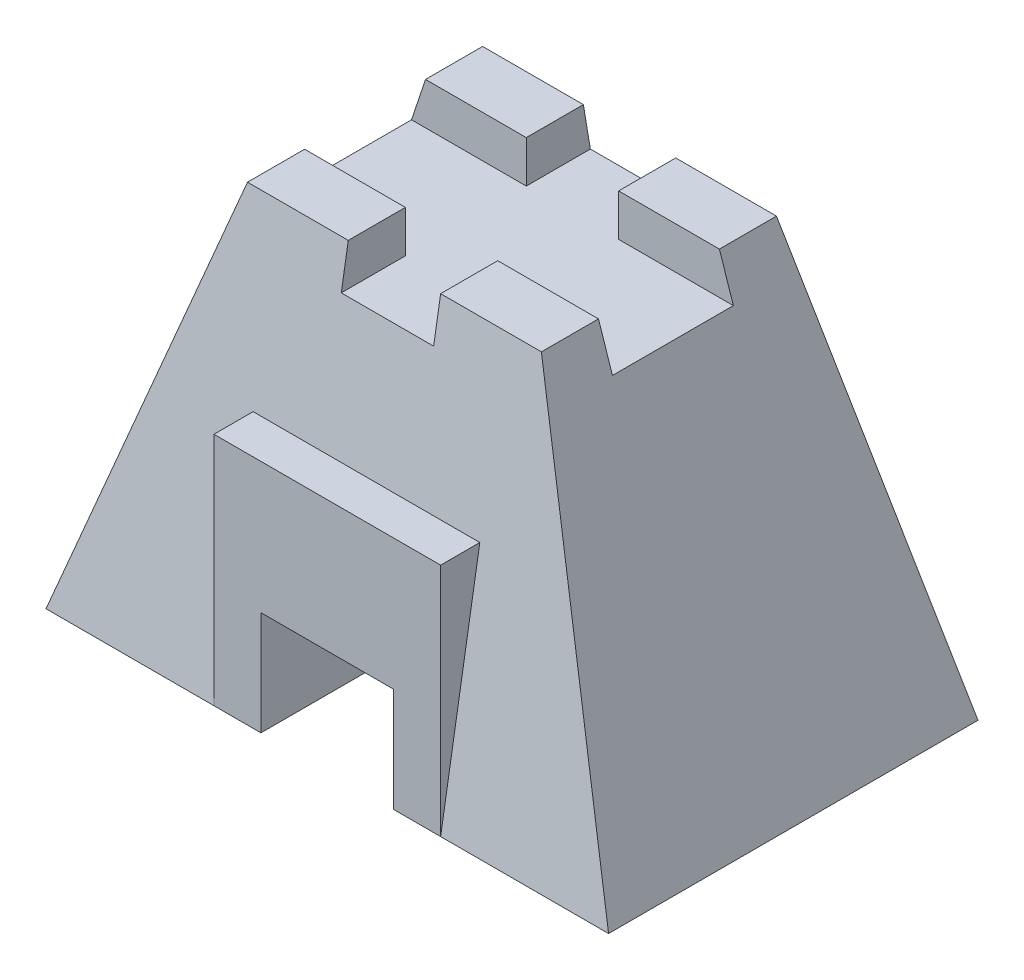
ISO-10303-21;
HEADER;
FILE_DESCRIPTION(('STEP AP214'),'2;1');
FILE_NAME('part.step','',(''),(''),'','','');
FILE_SCHEMA(('AUTOMOTIVE_DESIGN { 1 0 10303 214 1 1 1 1 }'));
ENDSEC;
DATA;
#1=APPLICATION_CONTEXT('core data for automotive mechanical design processes');
#2=APPLICATION_PROTOCOL_DEFINITION('international standard','automotive_design',2000,#1);
#3=PRODUCT_CONTEXT('',#1,'mechanical');
#4=PRODUCT('Part','Part','',(#3));
#5=PRODUCT_RELATED_PRODUCT_CATEGORY('part','',(#4));
#6=PRODUCT_DEFINITION_FORMATION('','',#4);
#7=PRODUCT_DEFINITION_CONTEXT('part definition',#1,'design');
#8=PRODUCT_DEFINITION('design','',#6,#7);
#9=PRODUCT_DEFINITION_SHAPE('','',#8);
#10=(LENGTH_UNIT() NAMED_UNIT(*) SI_UNIT(.MILLI.,.METRE.));
#11=(NAMED_UNIT(*) PLANE_ANGLE_UNIT() SI_UNIT($,.RADIAN.));
#12=(NAMED_UNIT(*) SI_UNIT($,.STERADIAN.) SOLID_ANGLE_UNIT());
#13=UNCERTAINTY_MEASURE_WITH_UNIT(LENGTH_MEASURE(1.E-05),#10,'distance_accuracy_value','');
#14=(GEOMETRIC_REPRESENTATION_CONTEXT(3) GLOBAL_UNCERTAINTY_ASSIGNED_CONTEXT((#13)) GLOBAL_UNIT_ASSIGNED_CONTEXT((#10,
#11,#12)) REPRESENTATION_CONTEXT('',''));
#15=CARTESIAN_POINT('',(0.,0.,0.));
#16=DIRECTION('',(0.,0.,1.));
#17=DIRECTION('',(1.,0.,0.));
#18=AXIS2_PLACEMENT_3D('',#15,#16,#17);
#19=CARTESIAN_POINT('',(0.,0.,0.));
#20=DIRECTION('',(0.,1.,0.));
#21=DIRECTION('',(0.,0.,1.));
#22=AXIS2_PLACEMENT_3D('',#19,#20,#21);
#23=PLANE('',#22);
#24=DIRECTION('',(-1.,0.,0.));
#25=VECTOR('',#24,1.);
#26=CARTESIAN_POINT('',(212.725,0.,-139.7));
#27=LINE('',#26,#25);
#28=CARTESIAN_POINT('',(-50.165,0.,-139.7));
#29=VERTEX_POINT('',#28);
#30=CARTESIAN_POINT('',(-212.725,0.,-139.7));
#31=VERTEX_POINT('',#30);
#32=EDGE_CURVE('E231',#29,#31,#27,.T.);
#33=ORIENTED_EDGE('',*,*,#32,.F.);
#34=DIRECTION('',(0.,0.,1.));
#35=VECTOR('',#34,1.);
#36=CARTESIAN_POINT('',(-50.165,0.,-261.556559371696));
#37=LINE('',#36,#35);
#38=CARTESIAN_POINT('',(-50.165,0.,139.7));
#39=VERTEX_POINT('',#38);
#40=EDGE_CURVE('E216',#29,#39,#37,.T.);
#41=ORIENTED_EDGE('',*,*,#40,.T.);
#42=DIRECTION('',(1.,0.,0.));
#43=VECTOR('',#42,1.);
#44=CARTESIAN_POINT('',(-85.725,0.,139.7));
#45=LINE('',#44,#43);
#46=CARTESIAN_POINT('',(-85.725,0.,139.7));
#47=VERTEX_POINT('',#46);
#48=EDGE_CURVE('E229',#47,#39,#45,.T.);
#49=ORIENTED_EDGE('',*,*,#48,.F.);
#50=DIRECTION('',(1.,0.,0.));
#51=VECTOR('',#50,1.);
#52=CARTESIAN_POINT('',(212.725,0.,139.7));
#53=LINE('',#52,#51);
#54=CARTESIAN_POINT('',(-212.725,0.,139.7));
#55=VERTEX_POINT('',#54);
#56=EDGE_CURVE('E253',#55,#47,#53,.T.);
#57=ORIENTED_EDGE('',*,*,#56,.F.);
#58=DIRECTION('',(0.,0.,1.));
#59=VECTOR('',#58,1.);
#60=CARTESIAN_POINT('',(-212.725,0.,139.7));
#61=LINE('',#60,#59);
#62=EDGE_CURVE('E594',#31,#55,#61,.T.);
#63=ORIENTED_EDGE('',*,*,#62,.F.);
#64=EDGE_LOOP('',(#33,#41,#49,#57,#63));
#65=FACE_BOUND('',#64,.T.);
#66=ADVANCED_FACE('F47',(#65),#23,.F.);
#67=CARTESIAN_POINT('',(0.,22.654054054054,135.924324324324));
#68=DIRECTION('',(0.,-0.164398987305357,-0.986393923832144));
#69=DIRECTION('',(0.,0.986393923832144,-0.164398987305357));
#70=AXIS2_PLACEMENT_3D('',#67,#68,#69);
#71=PLANE('',#70);
#72=DIRECTION('',(0.,-0.986393923832144,0.164398987305357));
#73=VECTOR('',#72,1.);
#74=CARTESIAN_POINT('',(-85.725,42.7326551276174,132.577890812064));
#75=LINE('',#74,#73);
#76=CARTESIAN_POINT('',(-85.725,177.8,110.066666666667));
#77=VERTEX_POINT('',#76);
#78=EDGE_CURVE('E74',#77,#47,#75,.T.);
#79=ORIENTED_EDGE('',*,*,#78,.F.);
#80=DIRECTION('',(-1.,0.,0.));
#81=VECTOR('',#80,1.);
#82=CARTESIAN_POINT('',(-85.725,177.8,110.066666666667));
#83=LINE('',#82,#81);
#84=CARTESIAN_POINT('',(85.725,177.8,110.066666666667));
#85=VERTEX_POINT('',#84);
#86=EDGE_CURVE('E632',#85,#77,#83,.T.);
#87=ORIENTED_EDGE('',*,*,#86,.F.);
#88=DIRECTION('',(0.,0.986393923832144,-0.164398987305357));
#89=VECTOR('',#88,1.);
#90=CARTESIAN_POINT('',(85.725,42.7326551276174,132.577890812064));
#91=LINE('',#90,#89);
#92=CARTESIAN_POINT('',(85.725,0.,139.7));
#93=VERTEX_POINT('',#92);
#94=EDGE_CURVE('E535',#93,#85,#91,.T.);
#95=ORIENTED_EDGE('',*,*,#94,.F.);
#96=CARTESIAN_POINT('',(212.725,0.,139.7));
#97=VERTEX_POINT('',#96);
#98=EDGE_CURVE('E258',#93,#97,#53,.T.);
#99=ORIENTED_EDGE('',*,*,#98,.T.);
#100=DIRECTION('',(-0.312347523777212,0.937042571331636,-0.156173761888606));
#101=VECTOR('',#100,1.);
#102=CARTESIAN_POINT('',(212.725,0.,139.7));
#103=LINE('',#102,#101);
#104=CARTESIAN_POINT('',(111.125,304.8,88.9));
#105=VERTEX_POINT('',#104);
#106=EDGE_CURVE('E676',#97,#105,#103,.T.);
#107=ORIENTED_EDGE('',*,*,#106,.T.);
#108=DIRECTION('',(1.,0.,0.));
#109=VECTOR('',#108,1.);
#110=CARTESIAN_POINT('',(111.125,304.8,88.9));
#111=LINE('',#110,#109);
#112=CARTESIAN_POINT('',(34.9249999999999,304.8,88.9));
#113=VERTEX_POINT('',#112);
#114=EDGE_CURVE('E458',#113,#105,#111,.T.);
#115=ORIENTED_EDGE('',*,*,#114,.F.);
#116=DIRECTION('',(0.,-0.986393923832144,0.164398987305357));
#117=VECTOR('',#116,1.);
#118=CARTESIAN_POINT('',(34.9249999999999,22.654054054054,135.924324324324));
#119=LINE('',#118,#117);
#120=CARTESIAN_POINT('',(34.9249999999999,273.05,94.1916666666667));
#121=VERTEX_POINT('',#120);
#122=EDGE_CURVE('E12',#113,#121,#119,.T.);
#123=ORIENTED_EDGE('',*,*,#122,.T.);
#124=DIRECTION('',(-1.,0.,0.));
#125=VECTOR('',#124,1.);
#126=CARTESIAN_POINT('',(0.,273.05,94.1916666666666));
#127=LINE('',#126,#125);
#128=CARTESIAN_POINT('',(-34.925,273.05,94.1916666666667));
#129=VERTEX_POINT('',#128);
#130=EDGE_CURVE('E586',#121,#129,#127,.T.);
#131=ORIENTED_EDGE('',*,*,#130,.T.);
#132=DIRECTION('',(0.,0.986393923832144,-0.164398987305357));
#133=VECTOR('',#132,1.);
#134=CARTESIAN_POINT('',(-34.925,22.654054054054,135.924324324324));
#135=LINE('',#134,#133);
#136=CARTESIAN_POINT('',(-34.925,304.8,88.9));
#137=VERTEX_POINT('',#136);
#138=EDGE_CURVE('E58',#129,#137,#135,.T.);
#139=ORIENTED_EDGE('',*,*,#138,.T.);
#140=CARTESIAN_POINT('',(-111.125,304.8,88.9));
#141=VERTEX_POINT('',#140);
#142=EDGE_CURVE('E315',#141,#137,#111,.T.);
#143=ORIENTED_EDGE('',*,*,#142,.F.);
#144=DIRECTION('',(0.312347523777212,0.937042571331636,-0.156173761888606));
#145=VECTOR('',#144,1.);
#146=CARTESIAN_POINT('',(-212.725,0.,139.7));
#147=LINE('',#146,#145);
#148=EDGE_CURVE('E513',#55,#141,#147,.T.);
#149=ORIENTED_EDGE('',*,*,#148,.F.);
#150=ORIENTED_EDGE('',*,*,#56,.T.);
#151=EDGE_LOOP('',(#79,#87,#95,#99,#107,#115,#123,#131,#139,#143,#149,#150));
#152=FACE_BOUND('',#151,.T.);
#153=ADVANCED_FACE('F491',(#152),#71,.F.);
#154=CARTESIAN_POINT('',(0.,304.8,0.));
#155=DIRECTION('',(0.,1.,0.));
#156=DIRECTION('',(0.,0.,1.));
#157=AXIS2_PLACEMENT_3D('',#154,#155,#156);
#158=PLANE('',#157);
#159=DIRECTION('',(-1.,0.,0.));
#160=VECTOR('',#159,1.);
#161=CARTESIAN_POINT('',(-34.925,304.8,-45.72));
#162=LINE('',#161,#160);
#163=CARTESIAN_POINT('',(-34.925,304.8,-45.72));
#164=VERTEX_POINT('',#163);
#165=CARTESIAN_POINT('',(-111.125,304.8,-45.72));
#166=VERTEX_POINT('',#165);
#167=EDGE_CURVE('E396',#164,#166,#162,.T.);
#168=ORIENTED_EDGE('',*,*,#167,.F.);
#169=DIRECTION('',(0.,0.,1.));
#170=VECTOR('',#169,1.);
#171=CARTESIAN_POINT('',(-34.925,304.8,-45.72));
#172=LINE('',#171,#170);
#173=CARTESIAN_POINT('',(-34.925,304.8,-88.9));
#174=VERTEX_POINT('',#173);
#175=EDGE_CURVE('E374',#174,#164,#172,.T.);
#176=ORIENTED_EDGE('',*,*,#175,.F.);
#177=DIRECTION('',(-1.,0.,0.));
#178=VECTOR('',#177,1.);
#179=CARTESIAN_POINT('',(111.125,304.8,-88.9));
#180=LINE('',#179,#178);
#181=CARTESIAN_POINT('',(-111.125,304.8,-88.9));
#182=VERTEX_POINT('',#181);
#183=EDGE_CURVE('E308',#174,#182,#180,.T.);
#184=ORIENTED_EDGE('',*,*,#183,.T.);
#185=DIRECTION('',(0.,0.,1.));
#186=VECTOR('',#185,1.);
#187=CARTESIAN_POINT('',(-111.125,304.8,88.9));
#188=LINE('',#187,#186);
#189=EDGE_CURVE('E705',#182,#166,#188,.T.);
#190=ORIENTED_EDGE('',*,*,#189,.T.);
#191=EDGE_LOOP('',(#168,#176,#184,#190));
#192=FACE_BOUND('',#191,.T.);
#193=ADVANCED_FACE('F500',(#192),#158,.T.);
#194=DIRECTION('',(0.,0.,-1.));
#195=VECTOR('',#194,1.);
#196=CARTESIAN_POINT('',(34.9249999999999,304.8,-45.72));
#197=LINE('',#196,#195);
#198=CARTESIAN_POINT('',(34.9249999999999,304.8,-45.72));
#199=VERTEX_POINT('',#198);
#200=CARTESIAN_POINT('',(34.9249999999999,304.8,-88.9));
#201=VERTEX_POINT('',#200);
#202=EDGE_CURVE('E419',#199,#201,#197,.T.);
#203=ORIENTED_EDGE('',*,*,#202,.F.);
#204=DIRECTION('',(-1.,0.,0.));
#205=VECTOR('',#204,1.);
#206=CARTESIAN_POINT('',(171.921254813928,304.8,-45.72));
#207=LINE('',#206,#205);
#208=CARTESIAN_POINT('',(111.125,304.8,-45.72));
#209=VERTEX_POINT('',#208);
#210=EDGE_CURVE('E417',#209,#199,#207,.T.);
#211=ORIENTED_EDGE('',*,*,#210,.F.);
#212=DIRECTION('',(0.,0.,-1.));
#213=VECTOR('',#212,1.);
#214=CARTESIAN_POINT('',(111.125,304.8,88.9));
#215=LINE('',#214,#213);
#216=CARTESIAN_POINT('',(111.125,304.8,-88.9));
#217=VERTEX_POINT('',#216);
#218=EDGE_CURVE('E331',#209,#217,#215,.T.);
#219=ORIENTED_EDGE('',*,*,#218,.T.);
#220=EDGE_CURVE('E352',#217,#201,#180,.T.);
#221=ORIENTED_EDGE('',*,*,#220,.T.);
#222=EDGE_LOOP('',(#203,#211,#219,#221));
#223=FACE_BOUND('',#222,.T.);
#224=ADVANCED_FACE('F730',(#223),#158,.T.);
#225=DIRECTION('',(1.,0.,0.));
#226=VECTOR('',#225,1.);
#227=CARTESIAN_POINT('',(171.921254813928,304.8,45.72));
#228=LINE('',#227,#226);
#229=CARTESIAN_POINT('',(34.9249999999999,304.8,45.72));
#230=VERTEX_POINT('',#229);
#231=CARTESIAN_POINT('',(111.125,304.8,45.72));
#232=VERTEX_POINT('',#231);
#233=EDGE_CURVE('E415',#230,#232,#228,.T.);
#234=ORIENTED_EDGE('',*,*,#233,.F.);
#235=DIRECTION('',(0.,0.,-1.));
#236=VECTOR('',#235,1.);
#237=CARTESIAN_POINT('',(34.9249999999999,304.8,107.229562048896));
#238=LINE('',#237,#236);
#239=EDGE_CURVE('E405',#113,#230,#238,.T.);
#240=ORIENTED_EDGE('',*,*,#239,.F.);
#241=ORIENTED_EDGE('',*,*,#114,.T.);
#242=EDGE_CURVE('E692',#105,#232,#215,.T.);
#243=ORIENTED_EDGE('',*,*,#242,.T.);
#244=EDGE_LOOP('',(#234,#240,#241,#243));
#245=FACE_BOUND('',#244,.T.);
#246=ADVANCED_FACE('F726',(#245),#158,.T.);
#247=DIRECTION('',(0.,0.,1.));
#248=VECTOR('',#247,1.);
#249=CARTESIAN_POINT('',(-34.925,304.8,107.229562048896));
#250=LINE('',#249,#248);
#251=CARTESIAN_POINT('',(-34.925,304.8,45.72));
#252=VERTEX_POINT('',#251);
#253=EDGE_CURVE('E403',#252,#137,#250,.T.);
#254=ORIENTED_EDGE('',*,*,#253,.F.);
#255=DIRECTION('',(1.,0.,0.));
#256=VECTOR('',#255,1.);
#257=CARTESIAN_POINT('',(-34.925,304.8,45.72));
#258=LINE('',#257,#256);
#259=CARTESIAN_POINT('',(-111.125,304.8,45.72));
#260=VERTEX_POINT('',#259);
#261=EDGE_CURVE('E399',#260,#252,#258,.T.);
#262=ORIENTED_EDGE('',*,*,#261,.F.);
#263=EDGE_CURVE('E453',#260,#141,#188,.T.);
#264=ORIENTED_EDGE('',*,*,#263,.T.);
#265=ORIENTED_EDGE('',*,*,#142,.T.);
#266=EDGE_LOOP('',(#254,#262,#264,#265));
#267=FACE_BOUND('',#266,.T.);
#268=ADVANCED_FACE('F49',(#267),#158,.T.);
#269=CARTESIAN_POINT('',(50.165,0.,139.7));
#270=VERTEX_POINT('',#269);
#271=EDGE_CURVE('E241',#270,#93,#45,.T.);
#272=ORIENTED_EDGE('',*,*,#271,.F.);
#273=DIRECTION('',(0.,0.,1.));
#274=VECTOR('',#273,1.);
#275=CARTESIAN_POINT('',(50.165,0.,-261.556559371696));
#276=LINE('',#275,#274);
#277=CARTESIAN_POINT('',(50.165,0.,-139.7));
#278=VERTEX_POINT('',#277);
#279=EDGE_CURVE('E66',#278,#270,#276,.T.);
#280=ORIENTED_EDGE('',*,*,#279,.F.);
#281=CARTESIAN_POINT('',(212.725,0.,-139.7));
#282=VERTEX_POINT('',#281);
#283=EDGE_CURVE('E52',#282,#278,#27,.T.);
#284=ORIENTED_EDGE('',*,*,#283,.F.);
#285=DIRECTION('',(0.,0.,-1.));
#286=VECTOR('',#285,1.);
#287=CARTESIAN_POINT('',(212.725,0.,139.7));
#288=LINE('',#287,#286);
#289=EDGE_CURVE('E550',#97,#282,#288,.T.);
#290=ORIENTED_EDGE('',*,*,#289,.F.);
#291=ORIENTED_EDGE('',*,*,#98,.F.);
#292=EDGE_LOOP('',(#272,#280,#284,#290,#291));
#293=FACE_BOUND('',#292,.T.);
#294=ADVANCED_FACE('F501',(#293),#23,.F.);
#295=CARTESIAN_POINT('',(-191.4525,63.8175,0.));
#296=DIRECTION('',(0.948683298050514,-0.316227766016838,0.));
#297=DIRECTION('',(0.316227766016838,0.948683298050514,0.));
#298=AXIS2_PLACEMENT_3D('',#295,#296,#297);
#299=PLANE('',#298);
#300=DIRECTION('',(0.312347523777212,0.937042571331636,0.156173761888606));
#301=VECTOR('',#300,1.);
#302=CARTESIAN_POINT('',(-212.725,0.,-139.7));
#303=LINE('',#302,#301);
#304=EDGE_CURVE('E271',#31,#182,#303,.T.);
#305=ORIENTED_EDGE('',*,*,#304,.F.);
#306=DIRECTION('',(0.233256168386668,0.699768505160003,0.675215224277196));
#307=VECTOR('',#306,1.);
#308=CARTESIAN_POINT('',(-193.827623416379,56.6921297508638,-84.9970677842542));
#309=LINE('',#308,#307);
#310=CARTESIAN_POINT('',(-164.465,144.78,0.));
#311=VERTEX_POINT('',#310);
#312=EDGE_CURVE('E361',#31,#311,#309,.T.);
#313=ORIENTED_EDGE('',*,*,#312,.T.);
#314=DIRECTION('',(-0.233256168386668,-0.699768505160003,0.675215224277196));
#315=VECTOR('',#314,1.);
#316=CARTESIAN_POINT('',(-148.193374735143,193.594875794571,-47.1020731351128));
#317=LINE('',#316,#315);
#318=EDGE_CURVE('E356',#311,#55,#317,.T.);
#319=ORIENTED_EDGE('',*,*,#318,.T.);
#320=ORIENTED_EDGE('',*,*,#148,.T.);
#321=ORIENTED_EDGE('',*,*,#263,.F.);
#322=DIRECTION('',(-0.316227766016838,-0.948683298050514,0.));
#323=VECTOR('',#322,1.);
#324=CARTESIAN_POINT('',(-191.4525,63.8175,45.72));
#325=LINE('',#324,#323);
#326=CARTESIAN_POINT('',(-121.708333333333,273.05,45.72));
#327=VERTEX_POINT('',#326);
#328=EDGE_CURVE('E577',#260,#327,#325,.T.);
#329=ORIENTED_EDGE('',*,*,#328,.T.);
#330=DIRECTION('',(0.,0.,-1.));
#331=VECTOR('',#330,1.);
#332=CARTESIAN_POINT('',(-121.708333333333,273.05,0.));
#333=LINE('',#332,#331);
#334=CARTESIAN_POINT('',(-121.708333333333,273.05,-45.72));
#335=VERTEX_POINT('',#334);
#336=EDGE_CURVE('E590',#327,#335,#333,.T.);
#337=ORIENTED_EDGE('',*,*,#336,.T.);
#338=DIRECTION('',(0.316227766016838,0.948683298050514,0.));
#339=VECTOR('',#338,1.);
#340=CARTESIAN_POINT('',(-191.4525,63.8175,-45.72));
#341=LINE('',#340,#339);
#342=EDGE_CURVE('E579',#335,#166,#341,.T.);
#343=ORIENTED_EDGE('',*,*,#342,.T.);
#344=ORIENTED_EDGE('',*,*,#189,.F.);
#345=EDGE_LOOP('',(#305,#313,#319,#320,#321,#329,#337,#343,#344));
#346=FACE_BOUND('',#345,.T.);
#347=ADVANCED_FACE('F504',(#346),#299,.F.);
#348=CARTESIAN_POINT('',(191.4525,63.8175,0.));
#349=DIRECTION('',(-0.948683298050514,-0.316227766016838,0.));
#350=DIRECTION('',(0.316227766016838,-0.948683298050514,0.));
#351=AXIS2_PLACEMENT_3D('',#348,#349,#350);
#352=PLANE('',#351);
#353=ORIENTED_EDGE('',*,*,#218,.F.);
#354=DIRECTION('',(0.316227766016838,-0.948683298050514,0.));
#355=VECTOR('',#354,1.);
#356=CARTESIAN_POINT('',(191.4525,63.8175,-45.72));
#357=LINE('',#356,#355);
#358=CARTESIAN_POINT('',(121.708333333333,273.05,-45.72));
#359=VERTEX_POINT('',#358);
#360=EDGE_CURVE('E580',#209,#359,#357,.T.);
#361=ORIENTED_EDGE('',*,*,#360,.T.);
#362=DIRECTION('',(0.,0.,1.));
#363=VECTOR('',#362,1.);
#364=CARTESIAN_POINT('',(121.708333333333,273.05,0.));
#365=LINE('',#364,#363);
#366=CARTESIAN_POINT('',(121.708333333333,273.05,45.72));
#367=VERTEX_POINT('',#366);
#368=EDGE_CURVE('E429',#359,#367,#365,.T.);
#369=ORIENTED_EDGE('',*,*,#368,.T.);
#370=DIRECTION('',(-0.316227766016838,0.948683298050514,0.));
#371=VECTOR('',#370,1.);
#372=CARTESIAN_POINT('',(191.4525,63.8175,45.72));
#373=LINE('',#372,#371);
#374=EDGE_CURVE('E322',#367,#232,#373,.T.);
#375=ORIENTED_EDGE('',*,*,#374,.T.);
#376=ORIENTED_EDGE('',*,*,#242,.F.);
#377=ORIENTED_EDGE('',*,*,#106,.F.);
#378=ORIENTED_EDGE('',*,*,#289,.T.);
#379=DIRECTION('',(-0.312347523777212,0.937042571331636,0.156173761888606));
#380=VECTOR('',#379,1.);
#381=CARTESIAN_POINT('',(212.725,0.,-139.7));
#382=LINE('',#381,#380);
#383=EDGE_CURVE('E652',#282,#217,#382,.T.);
#384=ORIENTED_EDGE('',*,*,#383,.T.);
#385=EDGE_LOOP('',(#353,#361,#369,#375,#376,#377,#378,#384));
#386=FACE_BOUND('',#385,.T.);
#387=ADVANCED_FACE('F284',(#386),#352,.F.);
#388=CARTESIAN_POINT('',(0.,22.6540540540541,-135.924324324324));
#389=DIRECTION('',(0.,-0.164398987305357,0.986393923832144));
#390=DIRECTION('',(0.,-0.986393923832144,-0.164398987305357));
#391=AXIS2_PLACEMENT_3D('',#388,#389,#390);
#392=PLANE('',#391);
#393=DIRECTION('',(1.,0.,0.));
#394=VECTOR('',#393,1.);
#395=CARTESIAN_POINT('',(-50.165,78.74,-126.576666666667));
#396=LINE('',#395,#394);
#397=CARTESIAN_POINT('',(-50.165,78.74,-126.576666666667));
#398=VERTEX_POINT('',#397);
#399=CARTESIAN_POINT('',(50.165,78.74,-126.576666666667));
#400=VERTEX_POINT('',#399);
#401=EDGE_CURVE('E616',#398,#400,#396,.T.);
#402=ORIENTED_EDGE('',*,*,#401,.F.);
#403=DIRECTION('',(0.,0.986393923832144,0.164398987305357));
#404=VECTOR('',#403,1.);
#405=CARTESIAN_POINT('',(-50.165,-19.7605231413562,-142.993420523559));
#406=LINE('',#405,#404);
#407=EDGE_CURVE('E617',#29,#398,#406,.T.);
#408=ORIENTED_EDGE('',*,*,#407,.F.);
#409=ORIENTED_EDGE('',*,*,#32,.T.);
#410=ORIENTED_EDGE('',*,*,#304,.T.);
#411=ORIENTED_EDGE('',*,*,#183,.F.);
#412=DIRECTION('',(0.,-0.986393923832144,-0.164398987305357));
#413=VECTOR('',#412,1.);
#414=CARTESIAN_POINT('',(-34.9249999999999,22.6540540540541,-135.924324324324));
#415=LINE('',#414,#413);
#416=CARTESIAN_POINT('',(-34.925,273.05,-94.1916666666667));
#417=VERTEX_POINT('',#416);
#418=EDGE_CURVE('E318',#174,#417,#415,.T.);
#419=ORIENTED_EDGE('',*,*,#418,.T.);
#420=DIRECTION('',(1.,0.,0.));
#421=VECTOR('',#420,1.);
#422=CARTESIAN_POINT('',(0.,273.05,-94.1916666666667));
#423=LINE('',#422,#421);
#424=CARTESIAN_POINT('',(34.9249999999999,273.05,-94.1916666666667));
#425=VERTEX_POINT('',#424);
#426=EDGE_CURVE('E311',#417,#425,#423,.T.);
#427=ORIENTED_EDGE('',*,*,#426,.T.);
#428=DIRECTION('',(0.,0.986393923832144,0.164398987305357));
#429=VECTOR('',#428,1.);
#430=CARTESIAN_POINT('',(34.9249999999999,22.6540540540541,-135.924324324324));
#431=LINE('',#430,#429);
#432=EDGE_CURVE('E314',#425,#201,#431,.T.);
#433=ORIENTED_EDGE('',*,*,#432,.T.);
#434=ORIENTED_EDGE('',*,*,#220,.F.);
#435=ORIENTED_EDGE('',*,*,#383,.F.);
#436=ORIENTED_EDGE('',*,*,#283,.T.);
#437=DIRECTION('',(0.,-0.986393923832144,-0.164398987305357));
#438=VECTOR('',#437,1.);
#439=CARTESIAN_POINT('',(50.165,-19.7605231413562,-142.993420523559));
#440=LINE('',#439,#438);
#441=EDGE_CURVE('E618',#400,#278,#440,.T.);
#442=ORIENTED_EDGE('',*,*,#441,.F.);
#443=EDGE_LOOP('',(#402,#408,#409,#410,#411,#419,#427,#433,#434,#435,#436,#442));
#444=FACE_BOUND('',#443,.T.);
#445=ADVANCED_FACE('F274',(#444),#392,.F.);
#446=CARTESIAN_POINT('',(34.9249999999999,273.05,107.229562048896));
#447=DIRECTION('',(1.,0.,0.));
#448=DIRECTION('',(0.,0.,-1.));
#449=AXIS2_PLACEMENT_3D('',#446,#447,#448);
#450=PLANE('',#449);
#451=ORIENTED_EDGE('',*,*,#239,.T.);
#452=DIRECTION('',(0.,1.,0.));
#453=VECTOR('',#452,1.);
#454=CARTESIAN_POINT('',(34.9249999999999,273.05,45.72));
#455=LINE('',#454,#453);
#456=CARTESIAN_POINT('',(34.9249999999999,273.05,45.72));
#457=VERTEX_POINT('',#456);
#458=EDGE_CURVE('E432',#457,#230,#455,.T.);
#459=ORIENTED_EDGE('',*,*,#458,.F.);
#460=DIRECTION('',(0.,0.,-1.));
#461=VECTOR('',#460,1.);
#462=CARTESIAN_POINT('',(34.9249999999999,273.05,107.229562048896));
#463=LINE('',#462,#461);
#464=EDGE_CURVE('E379',#121,#457,#463,.T.);
#465=ORIENTED_EDGE('',*,*,#464,.F.);
#466=ORIENTED_EDGE('',*,*,#122,.F.);
#467=EDGE_LOOP('',(#451,#459,#465,#466));
#468=FACE_BOUND('',#467,.T.);
#469=ADVANCED_FACE('F283',(#468),#450,.F.);
#470=CARTESIAN_POINT('',(-34.925,273.05,107.229562048896));
#471=DIRECTION('',(-1.,0.,0.));
#472=DIRECTION('',(0.,0.,1.));
#473=AXIS2_PLACEMENT_3D('',#470,#471,#472);
#474=PLANE('',#473);
#475=DIRECTION('',(0.,0.,1.));
#476=VECTOR('',#475,1.);
#477=CARTESIAN_POINT('',(-34.925,273.05,107.229562048896));
#478=LINE('',#477,#476);
#479=CARTESIAN_POINT('',(-34.925,273.05,45.72));
#480=VERTEX_POINT('',#479);
#481=EDGE_CURVE('E376',#480,#129,#478,.T.);
#482=ORIENTED_EDGE('',*,*,#481,.F.);
#483=DIRECTION('',(0.,1.,0.));
#484=VECTOR('',#483,1.);
#485=CARTESIAN_POINT('',(-34.925,273.05,45.72));
#486=LINE('',#485,#484);
#487=EDGE_CURVE('E390',#480,#252,#486,.T.);
#488=ORIENTED_EDGE('',*,*,#487,.T.);
#489=ORIENTED_EDGE('',*,*,#253,.T.);
#490=ORIENTED_EDGE('',*,*,#138,.F.);
#491=EDGE_LOOP('',(#482,#488,#489,#490));
#492=FACE_BOUND('',#491,.T.);
#493=ADVANCED_FACE('F443',(#492),#474,.F.);
#494=CARTESIAN_POINT('',(-34.925,273.05,-45.72));
#495=DIRECTION('',(0.,0.,-1.));
#496=DIRECTION('',(-1.,0.,0.));
#497=AXIS2_PLACEMENT_3D('',#494,#495,#496);
#498=PLANE('',#497);
#499=DIRECTION('',(-1.,0.,0.));
#500=VECTOR('',#499,1.);
#501=CARTESIAN_POINT('',(-34.925,273.05,-45.72));
#502=LINE('',#501,#500);
#503=CARTESIAN_POINT('',(-34.925,273.05,-45.72));
#504=VERTEX_POINT('',#503);
#505=EDGE_CURVE('E370',#504,#335,#502,.T.);
#506=ORIENTED_EDGE('',*,*,#505,.F.);
#507=DIRECTION('',(0.,1.,0.));
#508=VECTOR('',#507,1.);
#509=CARTESIAN_POINT('',(-34.925,273.05,-45.72));
#510=LINE('',#509,#508);
#511=EDGE_CURVE('E426',#504,#164,#510,.T.);
#512=ORIENTED_EDGE('',*,*,#511,.T.);
#513=ORIENTED_EDGE('',*,*,#167,.T.);
#514=ORIENTED_EDGE('',*,*,#342,.F.);
#515=EDGE_LOOP('',(#506,#512,#513,#514));
#516=FACE_BOUND('',#515,.T.);
#517=ADVANCED_FACE('F710',(#516),#498,.F.);
#518=CARTESIAN_POINT('',(-34.925,273.05,45.72));
#519=DIRECTION('',(0.,0.,1.));
#520=DIRECTION('',(1.,0.,0.));
#521=AXIS2_PLACEMENT_3D('',#518,#519,#520);
#522=PLANE('',#521);
#523=ORIENTED_EDGE('',*,*,#261,.T.);
#524=ORIENTED_EDGE('',*,*,#487,.F.);
#525=DIRECTION('',(1.,0.,0.));
#526=VECTOR('',#525,1.);
#527=CARTESIAN_POINT('',(-34.925,273.05,45.72));
#528=LINE('',#527,#526);
#529=EDGE_CURVE('E373',#327,#480,#528,.T.);
#530=ORIENTED_EDGE('',*,*,#529,.F.);
#531=ORIENTED_EDGE('',*,*,#328,.F.);
#532=EDGE_LOOP('',(#523,#524,#530,#531));
#533=FACE_BOUND('',#532,.T.);
#534=ADVANCED_FACE('F591',(#533),#522,.F.);
#535=CARTESIAN_POINT('',(171.921254813928,273.05,-45.72));
#536=DIRECTION('',(0.,0.,-1.));
#537=DIRECTION('',(-1.,0.,0.));
#538=AXIS2_PLACEMENT_3D('',#535,#536,#537);
#539=PLANE('',#538);
#540=ORIENTED_EDGE('',*,*,#210,.T.);
#541=DIRECTION('',(0.,1.,0.));
#542=VECTOR('',#541,1.);
#543=CARTESIAN_POINT('',(34.9249999999999,273.05,-45.72));
#544=LINE('',#543,#542);
#545=CARTESIAN_POINT('',(34.9249999999999,273.05,-45.72));
#546=VERTEX_POINT('',#545);
#547=EDGE_CURVE('E430',#546,#199,#544,.T.);
#548=ORIENTED_EDGE('',*,*,#547,.F.);
#549=DIRECTION('',(-1.,0.,0.));
#550=VECTOR('',#549,1.);
#551=CARTESIAN_POINT('',(171.921254813928,273.05,-45.72));
#552=LINE('',#551,#550);
#553=EDGE_CURVE('E384',#359,#546,#552,.T.);
#554=ORIENTED_EDGE('',*,*,#553,.F.);
#555=ORIENTED_EDGE('',*,*,#360,.F.);
#556=EDGE_LOOP('',(#540,#548,#554,#555));
#557=FACE_BOUND('',#556,.T.);
#558=ADVANCED_FACE('F602',(#557),#539,.F.);
#559=CARTESIAN_POINT('',(171.921254813928,273.05,45.72));
#560=DIRECTION('',(0.,0.,1.));
#561=DIRECTION('',(1.,0.,0.));
#562=AXIS2_PLACEMENT_3D('',#559,#560,#561);
#563=PLANE('',#562);
#564=DIRECTION('',(1.,0.,0.));
#565=VECTOR('',#564,1.);
#566=CARTESIAN_POINT('',(171.921254813928,273.05,45.72));
#567=LINE('',#566,#565);
#568=EDGE_CURVE('E381',#457,#367,#567,.T.);
#569=ORIENTED_EDGE('',*,*,#568,.F.);
#570=ORIENTED_EDGE('',*,*,#458,.T.);
#571=ORIENTED_EDGE('',*,*,#233,.T.);
#572=ORIENTED_EDGE('',*,*,#374,.F.);
#573=EDGE_LOOP('',(#569,#570,#571,#572));
#574=FACE_BOUND('',#573,.T.);
#575=ADVANCED_FACE('F790',(#574),#563,.F.);
#576=CARTESIAN_POINT('',(-34.925,273.05,-45.72));
#577=DIRECTION('',(-1.,0.,0.));
#578=DIRECTION('',(0.,0.,1.));
#579=AXIS2_PLACEMENT_3D('',#576,#577,#578);
#580=PLANE('',#579);
#581=ORIENTED_EDGE('',*,*,#175,.T.);
#582=ORIENTED_EDGE('',*,*,#511,.F.);
#583=DIRECTION('',(0.,0.,1.));
#584=VECTOR('',#583,1.);
#585=CARTESIAN_POINT('',(-34.925,273.05,-45.72));
#586=LINE('',#585,#584);
#587=EDGE_CURVE('E388',#417,#504,#586,.T.);
#588=ORIENTED_EDGE('',*,*,#587,.F.);
#589=ORIENTED_EDGE('',*,*,#418,.F.);
#590=EDGE_LOOP('',(#581,#582,#588,#589));
#591=FACE_BOUND('',#590,.T.);
#592=ADVANCED_FACE('F611',(#591),#580,.F.);
#593=CARTESIAN_POINT('',(34.9249999999999,273.05,-45.72));
#594=DIRECTION('',(1.,0.,0.));
#595=DIRECTION('',(0.,0.,-1.));
#596=AXIS2_PLACEMENT_3D('',#593,#594,#595);
#597=PLANE('',#596);
#598=DIRECTION('',(0.,0.,-1.));
#599=VECTOR('',#598,1.);
#600=CARTESIAN_POINT('',(34.9249999999999,273.05,-45.72));
#601=LINE('',#600,#599);
#602=EDGE_CURVE('E386',#546,#425,#601,.T.);
#603=ORIENTED_EDGE('',*,*,#602,.F.);
#604=ORIENTED_EDGE('',*,*,#547,.T.);
#605=ORIENTED_EDGE('',*,*,#202,.T.);
#606=ORIENTED_EDGE('',*,*,#432,.F.);
#607=EDGE_LOOP('',(#603,#604,#605,#606));
#608=FACE_BOUND('',#607,.T.);
#609=ADVANCED_FACE('F607',(#608),#597,.F.);
#610=CARTESIAN_POINT('',(0.,273.05,0.));
#611=DIRECTION('',(0.,-1.,0.));
#612=DIRECTION('',(0.,0.,-1.));
#613=AXIS2_PLACEMENT_3D('',#610,#611,#612);
#614=PLANE('',#613);
#615=ORIENTED_EDGE('',*,*,#464,.T.);
#616=ORIENTED_EDGE('',*,*,#568,.T.);
#617=ORIENTED_EDGE('',*,*,#368,.F.);
#618=ORIENTED_EDGE('',*,*,#553,.T.);
#619=ORIENTED_EDGE('',*,*,#602,.T.);
#620=ORIENTED_EDGE('',*,*,#426,.F.);
#621=ORIENTED_EDGE('',*,*,#587,.T.);
#622=ORIENTED_EDGE('',*,*,#505,.T.);
#623=ORIENTED_EDGE('',*,*,#336,.F.);
#624=ORIENTED_EDGE('',*,*,#529,.T.);
#625=ORIENTED_EDGE('',*,*,#481,.T.);
#626=ORIENTED_EDGE('',*,*,#130,.F.);
#627=EDGE_LOOP('',(#615,#616,#617,#618,#619,#620,#621,#622,#623,#624,#625,#626));
#628=FACE_BOUND('',#627,.T.);
#629=ADVANCED_FACE('F588',(#628),#614,.F.);
#630=CARTESIAN_POINT('',(-212.725,0.,0.));
#631=DIRECTION('',(1.,0.,0.));
#632=DIRECTION('',(0.,0.,-1.));
#633=AXIS2_PLACEMENT_3D('',#630,#631,#632);
#634=PLANE('',#633);
#635=ORIENTED_EDGE('',*,*,#62,.T.);
#636=DIRECTION('',(0.,-0.719618961972478,0.694369173833093));
#637=VECTOR('',#636,1.);
#638=CARTESIAN_POINT('',(-212.725,144.78,0.));
#639=LINE('',#638,#637);
#640=CARTESIAN_POINT('',(-212.725,144.78,0.));
#641=VERTEX_POINT('',#640);
#642=EDGE_CURVE('E362',#641,#55,#639,.T.);
#643=ORIENTED_EDGE('',*,*,#642,.F.);
#644=DIRECTION('',(0.,0.719618961972478,0.694369173833093));
#645=VECTOR('',#644,1.);
#646=CARTESIAN_POINT('',(-212.725,0.,-139.7));
#647=LINE('',#646,#645);
#648=EDGE_CURVE('E400',#31,#641,#647,.T.);
#649=ORIENTED_EDGE('',*,*,#648,.F.);
#650=EDGE_LOOP('',(#635,#643,#649));
#651=FACE_BOUND('',#650,.T.);
#652=ADVANCED_FACE('F823',(#651),#634,.F.);
#653=CARTESIAN_POINT('',(134.599359092319,144.78,0.));
#654=DIRECTION('',(0.,-0.694369173833093,-0.719618961972478));
#655=DIRECTION('',(0.,0.719618961972478,-0.694369173833093));
#656=AXIS2_PLACEMENT_3D('',#653,#654,#655);
#657=PLANE('',#656);
#658=ORIENTED_EDGE('',*,*,#318,.F.);
#659=DIRECTION('',(-1.,0.,0.));
#660=VECTOR('',#659,1.);
#661=CARTESIAN_POINT('',(134.599359092319,144.78,0.));
#662=LINE('',#661,#660);
#663=EDGE_CURVE('E360',#311,#641,#662,.T.);
#664=ORIENTED_EDGE('',*,*,#663,.T.);
#665=ORIENTED_EDGE('',*,*,#642,.T.);
#666=EDGE_LOOP('',(#658,#664,#665));
#667=FACE_BOUND('',#666,.T.);
#668=ADVANCED_FACE('F675',(#667),#657,.F.);
#669=CARTESIAN_POINT('',(134.599359092319,0.,-139.7));
#670=DIRECTION('',(0.,-0.694369173833093,0.719618961972478));
#671=DIRECTION('',(0.,-0.719618961972478,-0.694369173833093));
#672=AXIS2_PLACEMENT_3D('',#669,#670,#671);
#673=PLANE('',#672);
#674=ORIENTED_EDGE('',*,*,#312,.F.);
#675=ORIENTED_EDGE('',*,*,#648,.T.);
#676=ORIENTED_EDGE('',*,*,#663,.F.);
#677=EDGE_LOOP('',(#674,#675,#676));
#678=FACE_BOUND('',#677,.T.);
#679=ADVANCED_FACE('F845',(#678),#673,.F.);
#680=CARTESIAN_POINT('',(0.,0.,139.7));
#681=DIRECTION('',(0.,0.,-1.));
#682=DIRECTION('',(-1.,0.,0.));
#683=AXIS2_PLACEMENT_3D('',#680,#681,#682);
#684=PLANE('',#683);
#685=ORIENTED_EDGE('',*,*,#48,.T.);
#686=DIRECTION('',(0.,-1.,0.));
#687=VECTOR('',#686,1.);
#688=CARTESIAN_POINT('',(-50.165,0.,139.7));
#689=LINE('',#688,#687);
#690=CARTESIAN_POINT('',(-50.165,78.74,139.7));
#691=VERTEX_POINT('',#690);
#692=EDGE_CURVE('E213',#691,#39,#689,.T.);
#693=ORIENTED_EDGE('',*,*,#692,.F.);
#694=DIRECTION('',(-1.,0.,0.));
#695=VECTOR('',#694,1.);
#696=CARTESIAN_POINT('',(-50.165,78.74,139.7));
#697=LINE('',#696,#695);
#698=CARTESIAN_POINT('',(50.165,78.74,139.7));
#699=VERTEX_POINT('',#698);
#700=EDGE_CURVE('E233',#699,#691,#697,.T.);
#701=ORIENTED_EDGE('',*,*,#700,.F.);
#702=DIRECTION('',(0.,1.,0.));
#703=VECTOR('',#702,1.);
#704=CARTESIAN_POINT('',(50.165,0.,139.7));
#705=LINE('',#704,#703);
#706=EDGE_CURVE('E224',#270,#699,#705,.T.);
#707=ORIENTED_EDGE('',*,*,#706,.F.);
#708=ORIENTED_EDGE('',*,*,#271,.T.);
#709=DIRECTION('',(0.,1.,0.));
#710=VECTOR('',#709,1.);
#711=CARTESIAN_POINT('',(85.725,0.,139.7));
#712=LINE('',#711,#710);
#713=CARTESIAN_POINT('',(85.725,177.8,139.7));
#714=VERTEX_POINT('',#713);
#715=EDGE_CURVE('E240',#93,#714,#712,.T.);
#716=ORIENTED_EDGE('',*,*,#715,.T.);
#717=DIRECTION('',(-1.,0.,0.));
#718=VECTOR('',#717,1.);
#719=CARTESIAN_POINT('',(-85.725,177.8,139.7));
#720=LINE('',#719,#718);
#721=CARTESIAN_POINT('',(-85.725,177.8,139.7));
#722=VERTEX_POINT('',#721);
#723=EDGE_CURVE('E244',#714,#722,#720,.T.);
#724=ORIENTED_EDGE('',*,*,#723,.T.);
#725=DIRECTION('',(0.,-1.,0.));
#726=VECTOR('',#725,1.);
#727=CARTESIAN_POINT('',(-85.725,0.,139.7));
#728=LINE('',#727,#726);
#729=EDGE_CURVE('E239',#722,#47,#728,.T.);
#730=ORIENTED_EDGE('',*,*,#729,.T.);
#731=EDGE_LOOP('',(#685,#693,#701,#707,#708,#716,#724,#730));
#732=FACE_BOUND('',#731,.T.);
#733=ADVANCED_FACE('F236',(#732),#684,.F.);
#734=CARTESIAN_POINT('',(85.725,0.,-123.818039953641));
#735=DIRECTION('',(1.,0.,0.));
#736=DIRECTION('',(0.,0.,-1.));
#737=AXIS2_PLACEMENT_3D('',#734,#735,#736);
#738=PLANE('',#737);
#739=ORIENTED_EDGE('',*,*,#715,.F.);
#740=ORIENTED_EDGE('',*,*,#94,.T.);
#741=DIRECTION('',(0.,0.,1.));
#742=VECTOR('',#741,1.);
#743=CARTESIAN_POINT('',(85.725,177.8,-123.818039953641));
#744=LINE('',#743,#742);
#745=EDGE_CURVE('E367',#85,#714,#744,.T.);
#746=ORIENTED_EDGE('',*,*,#745,.T.);
#747=EDGE_LOOP('',(#739,#740,#746));
#748=FACE_BOUND('',#747,.T.);
#749=ADVANCED_FACE('F647',(#748),#738,.T.);
#750=CARTESIAN_POINT('',(-85.725,177.8,-123.818039953641));
#751=DIRECTION('',(0.,1.,0.));
#752=DIRECTION('',(0.,0.,1.));
#753=AXIS2_PLACEMENT_3D('',#750,#751,#752);
#754=PLANE('',#753);
#755=ORIENTED_EDGE('',*,*,#745,.F.);
#756=ORIENTED_EDGE('',*,*,#86,.T.);
#757=DIRECTION('',(0.,0.,1.));
#758=VECTOR('',#757,1.);
#759=CARTESIAN_POINT('',(-85.725,177.8,-123.818039953641));
#760=LINE('',#759,#758);
#761=EDGE_CURVE('E635',#77,#722,#760,.T.);
#762=ORIENTED_EDGE('',*,*,#761,.T.);
#763=ORIENTED_EDGE('',*,*,#723,.F.);
#764=EDGE_LOOP('',(#755,#756,#762,#763));
#765=FACE_BOUND('',#764,.T.);
#766=ADVANCED_FACE('F648',(#765),#754,.T.);
#767=CARTESIAN_POINT('',(-85.725,0.,-123.818039953641));
#768=DIRECTION('',(-1.,0.,0.));
#769=DIRECTION('',(0.,0.,1.));
#770=AXIS2_PLACEMENT_3D('',#767,#768,#769);
#771=PLANE('',#770);
#772=ORIENTED_EDGE('',*,*,#761,.F.);
#773=ORIENTED_EDGE('',*,*,#78,.T.);
#774=ORIENTED_EDGE('',*,*,#729,.F.);
#775=EDGE_LOOP('',(#772,#773,#774));
#776=FACE_BOUND('',#775,.T.);
#777=ADVANCED_FACE('F878',(#776),#771,.T.);
#778=CARTESIAN_POINT('',(-50.165,0.,-261.556559371696));
#779=DIRECTION('',(-1.,0.,0.));
#780=DIRECTION('',(0.,0.,1.));
#781=AXIS2_PLACEMENT_3D('',#778,#779,#780);
#782=PLANE('',#781);
#783=ORIENTED_EDGE('',*,*,#407,.T.);
#784=DIRECTION('',(0.,0.,1.));
#785=VECTOR('',#784,1.);
#786=CARTESIAN_POINT('',(-50.165,78.74,-261.556559371696));
#787=LINE('',#786,#785);
#788=EDGE_CURVE('E219',#398,#691,#787,.T.);
#789=ORIENTED_EDGE('',*,*,#788,.T.);
#790=ORIENTED_EDGE('',*,*,#692,.T.);
#791=ORIENTED_EDGE('',*,*,#40,.F.);
#792=EDGE_LOOP('',(#783,#789,#790,#791));
#793=FACE_BOUND('',#792,.T.);
#794=ADVANCED_FACE('F215',(#793),#782,.F.);
#795=CARTESIAN_POINT('',(-50.165,78.74,-261.556559371696));
#796=DIRECTION('',(0.,1.,0.));
#797=DIRECTION('',(0.,0.,1.));
#798=AXIS2_PLACEMENT_3D('',#795,#796,#797);
#799=PLANE('',#798);
#800=ORIENTED_EDGE('',*,*,#401,.T.);
#801=DIRECTION('',(0.,0.,1.));
#802=VECTOR('',#801,1.);
#803=CARTESIAN_POINT('',(50.165,78.74,-261.556559371696));
#804=LINE('',#803,#802);
#805=EDGE_CURVE('E627',#400,#699,#804,.T.);
#806=ORIENTED_EDGE('',*,*,#805,.T.);
#807=ORIENTED_EDGE('',*,*,#700,.T.);
#808=ORIENTED_EDGE('',*,*,#788,.F.);
#809=EDGE_LOOP('',(#800,#806,#807,#808));
#810=FACE_BOUND('',#809,.T.);
#811=ADVANCED_FACE('F913',(#810),#799,.F.);
#812=CARTESIAN_POINT('',(50.165,0.,-261.556559371696));
#813=DIRECTION('',(1.,0.,0.));
#814=DIRECTION('',(0.,0.,-1.));
#815=AXIS2_PLACEMENT_3D('',#812,#813,#814);
#816=PLANE('',#815);
#817=ORIENTED_EDGE('',*,*,#441,.T.);
#818=ORIENTED_EDGE('',*,*,#279,.T.);
#819=ORIENTED_EDGE('',*,*,#706,.T.);
#820=ORIENTED_EDGE('',*,*,#805,.F.);
#821=EDGE_LOOP('',(#817,#818,#819,#820));
#822=FACE_BOUND('',#821,.T.);
#823=ADVANCED_FACE('F922',(#822),#816,.F.);
#824=CLOSED_SHELL('',(#66,#153,#193,#224,#246,#268,#294,#347,#387,#445,#469,#493,#517,#534,#558,
#575,#592,#609,#629,#652,#668,#679,#733,#749,#766,#777,#794,#811,#823));
#825=MANIFOLD_SOLID_BREP('B2',#824);
#826=ADVANCED_BREP_SHAPE_REPRESENTATION('',(#18,#825),#14);
#827=SHAPE_DEFINITION_REPRESENTATION(#9,#826);
ENDSEC;
END-ISO-10303-21;
